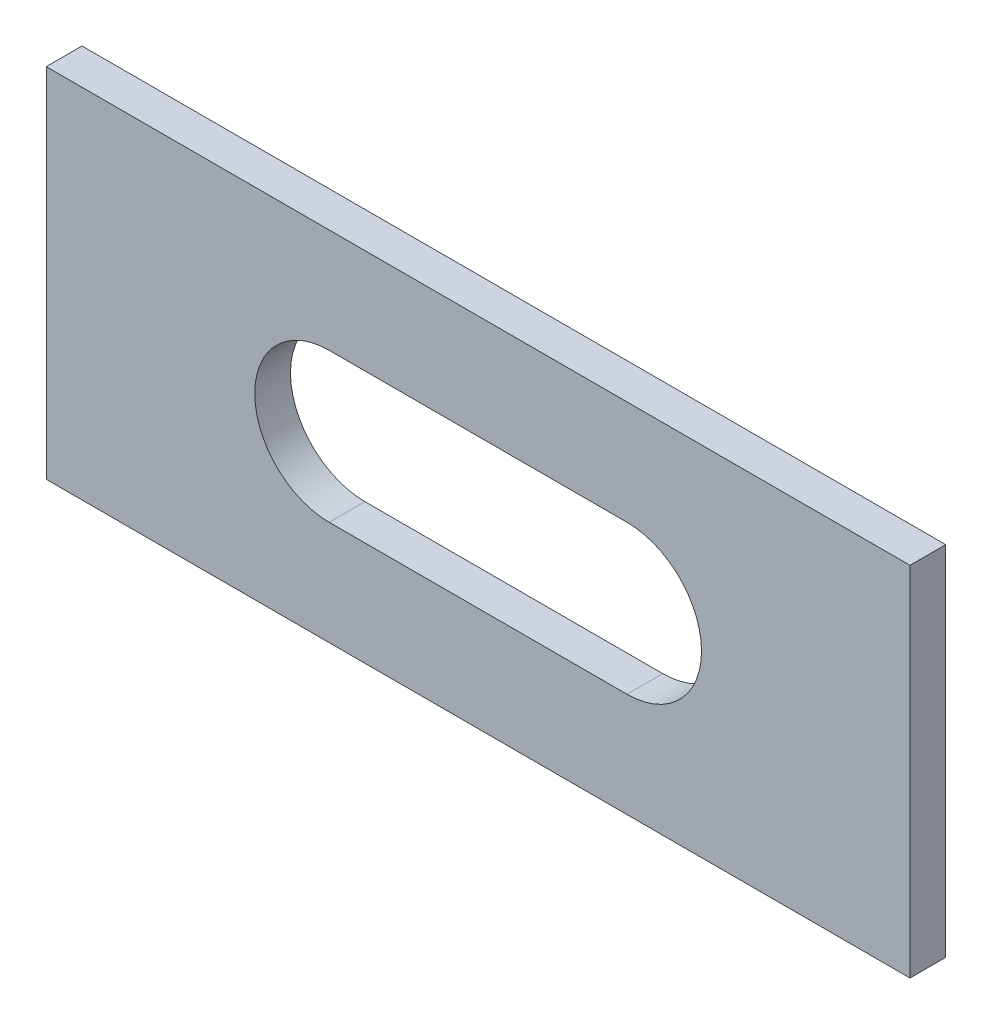
ISO-10303-21;
HEADER;
FILE_DESCRIPTION(('STEP AP214'),'2;1');
FILE_NAME('part.step','',(''),(''),'','','');
FILE_SCHEMA(('AUTOMOTIVE_DESIGN { 1 0 10303 214 1 1 1 1 }'));
ENDSEC;
DATA;
#1=APPLICATION_CONTEXT('core data for automotive mechanical design processes');
#2=APPLICATION_PROTOCOL_DEFINITION('international standard','automotive_design',2000,#1);
#3=PRODUCT_CONTEXT('',#1,'mechanical');
#4=PRODUCT('Part','Part','',(#3));
#5=PRODUCT_RELATED_PRODUCT_CATEGORY('part','',(#4));
#6=PRODUCT_DEFINITION_FORMATION('','',#4);
#7=PRODUCT_DEFINITION_CONTEXT('part definition',#1,'design');
#8=PRODUCT_DEFINITION('design','',#6,#7);
#9=PRODUCT_DEFINITION_SHAPE('','',#8);
#10=(LENGTH_UNIT() NAMED_UNIT(*) SI_UNIT(.MILLI.,.METRE.));
#11=(NAMED_UNIT(*) PLANE_ANGLE_UNIT() SI_UNIT($,.RADIAN.));
#12=(NAMED_UNIT(*) SI_UNIT($,.STERADIAN.) SOLID_ANGLE_UNIT());
#13=UNCERTAINTY_MEASURE_WITH_UNIT(LENGTH_MEASURE(1.E-05),#10,'distance_accuracy_value','');
#14=(GEOMETRIC_REPRESENTATION_CONTEXT(3) GLOBAL_UNCERTAINTY_ASSIGNED_CONTEXT((#13)) GLOBAL_UNIT_ASSIGNED_CONTEXT((#10,
#11,#12)) REPRESENTATION_CONTEXT('',''));
#15=CARTESIAN_POINT('',(0.,0.,0.));
#16=DIRECTION('',(0.,0.,1.));
#17=DIRECTION('',(1.,0.,0.));
#18=AXIS2_PLACEMENT_3D('',#15,#16,#17);
#19=CARTESIAN_POINT('',(0.,0.,6.));
#20=DIRECTION('',(0.,0.,1.));
#21=DIRECTION('',(1.,0.,0.));
#22=AXIS2_PLACEMENT_3D('',#19,#20,#21);
#23=PLANE('',#22);
#24=DIRECTION('',(0.,-1.,0.));
#25=VECTOR('',#24,1.);
#26=CARTESIAN_POINT('',(-72.5,-30.,6.));
#27=LINE('',#26,#25);
#28=CARTESIAN_POINT('',(-72.5,30.,6.));
#29=VERTEX_POINT('',#28);
#30=CARTESIAN_POINT('',(-72.5,-30.,6.));
#31=VERTEX_POINT('',#30);
#32=EDGE_CURVE('E133',#29,#31,#27,.T.);
#33=ORIENTED_EDGE('',*,*,#32,.T.);
#34=DIRECTION('',(1.,0.,0.));
#35=VECTOR('',#34,1.);
#36=CARTESIAN_POINT('',(72.5,-30.,6.));
#37=LINE('',#36,#35);
#38=CARTESIAN_POINT('',(72.5,-30.,6.));
#39=VERTEX_POINT('',#38);
#40=EDGE_CURVE('E136',#31,#39,#37,.T.);
#41=ORIENTED_EDGE('',*,*,#40,.T.);
#42=DIRECTION('',(0.,1.,0.));
#43=VECTOR('',#42,1.);
#44=CARTESIAN_POINT('',(72.5,-30.,6.));
#45=LINE('',#44,#43);
#46=CARTESIAN_POINT('',(72.5,30.,6.));
#47=VERTEX_POINT('',#46);
#48=EDGE_CURVE('E139',#39,#47,#45,.T.);
#49=ORIENTED_EDGE('',*,*,#48,.T.);
#50=DIRECTION('',(-1.,0.,0.));
#51=VECTOR('',#50,1.);
#52=CARTESIAN_POINT('',(72.5,30.,6.));
#53=LINE('',#52,#51);
#54=EDGE_CURVE('E141',#47,#29,#53,.T.);
#55=ORIENTED_EDGE('',*,*,#54,.T.);
#56=EDGE_LOOP('',(#33,#41,#49,#55));
#57=FACE_BOUND('',#56,.T.);
#58=DIRECTION('',(1.,0.,0.));
#59=VECTOR('',#58,1.);
#60=CARTESIAN_POINT('',(-25.,-12.5,6.));
#61=LINE('',#60,#59);
#62=CARTESIAN_POINT('',(-25.,-12.5,6.));
#63=VERTEX_POINT('',#62);
#64=CARTESIAN_POINT('',(25.,-12.5,6.));
#65=VERTEX_POINT('',#64);
#66=EDGE_CURVE('E105',#63,#65,#61,.T.);
#67=ORIENTED_EDGE('',*,*,#66,.F.);
#68=CARTESIAN_POINT('',(-25.,0.,6.));
#69=DIRECTION('',(0.,0.,1.));
#70=DIRECTION('',(1.,0.,0.));
#71=AXIS2_PLACEMENT_3D('',#68,#69,#70);
#72=CIRCLE('',#71,12.5);
#73=CARTESIAN_POINT('',(-25.,12.5,6.));
#74=VERTEX_POINT('',#73);
#75=EDGE_CURVE('E97',#74,#63,#72,.T.);
#76=ORIENTED_EDGE('',*,*,#75,.F.);
#77=DIRECTION('',(-1.,0.,0.));
#78=VECTOR('',#77,1.);
#79=CARTESIAN_POINT('',(-25.,12.5,6.));
#80=LINE('',#79,#78);
#81=CARTESIAN_POINT('',(25.,12.5,6.));
#82=VERTEX_POINT('',#81);
#83=EDGE_CURVE('E119',#82,#74,#80,.T.);
#84=ORIENTED_EDGE('',*,*,#83,.F.);
#85=CARTESIAN_POINT('',(25.,0.,6.));
#86=DIRECTION('',(0.,0.,1.));
#87=DIRECTION('',(1.,0.,0.));
#88=AXIS2_PLACEMENT_3D('',#85,#86,#87);
#89=CIRCLE('',#88,12.5);
#90=EDGE_CURVE('E117',#65,#82,#89,.T.);
#91=ORIENTED_EDGE('',*,*,#90,.F.);
#92=EDGE_LOOP('',(#67,#76,#84,#91));
#93=FACE_BOUND('',#92,.T.);
#94=ADVANCED_FACE('F32',(#57,#93),#23,.T.);
#95=CARTESIAN_POINT('',(0.,0.,0.));
#96=DIRECTION('',(0.,0.,1.));
#97=DIRECTION('',(1.,0.,0.));
#98=AXIS2_PLACEMENT_3D('',#95,#96,#97);
#99=PLANE('',#98);
#100=DIRECTION('',(0.,-1.,0.));
#101=VECTOR('',#100,1.);
#102=CARTESIAN_POINT('',(-72.5,-30.,0.));
#103=LINE('',#102,#101);
#104=CARTESIAN_POINT('',(-72.5,30.,0.));
#105=VERTEX_POINT('',#104);
#106=CARTESIAN_POINT('',(-72.5,-30.,0.));
#107=VERTEX_POINT('',#106);
#108=EDGE_CURVE('E113',#105,#107,#103,.T.);
#109=ORIENTED_EDGE('',*,*,#108,.F.);
#110=DIRECTION('',(-1.,0.,0.));
#111=VECTOR('',#110,1.);
#112=CARTESIAN_POINT('',(72.5,30.,0.));
#113=LINE('',#112,#111);
#114=CARTESIAN_POINT('',(72.5,30.,0.));
#115=VERTEX_POINT('',#114);
#116=EDGE_CURVE('E137',#115,#105,#113,.T.);
#117=ORIENTED_EDGE('',*,*,#116,.F.);
#118=DIRECTION('',(0.,1.,0.));
#119=VECTOR('',#118,1.);
#120=CARTESIAN_POINT('',(72.5,-30.,0.));
#121=LINE('',#120,#119);
#122=CARTESIAN_POINT('',(72.5,-30.,0.));
#123=VERTEX_POINT('',#122);
#124=EDGE_CURVE('E148',#123,#115,#121,.T.);
#125=ORIENTED_EDGE('',*,*,#124,.F.);
#126=DIRECTION('',(1.,0.,0.));
#127=VECTOR('',#126,1.);
#128=CARTESIAN_POINT('',(72.5,-30.,0.));
#129=LINE('',#128,#127);
#130=EDGE_CURVE('E146',#107,#123,#129,.T.);
#131=ORIENTED_EDGE('',*,*,#130,.F.);
#132=EDGE_LOOP('',(#109,#117,#125,#131));
#133=FACE_BOUND('',#132,.T.);
#134=CARTESIAN_POINT('',(-25.,0.,0.));
#135=DIRECTION('',(0.,0.,1.));
#136=DIRECTION('',(1.,0.,0.));
#137=AXIS2_PLACEMENT_3D('',#134,#135,#136);
#138=CIRCLE('',#137,12.5);
#139=CARTESIAN_POINT('',(-25.,12.5,0.));
#140=VERTEX_POINT('',#139);
#141=CARTESIAN_POINT('',(-25.,-12.5,0.));
#142=VERTEX_POINT('',#141);
#143=EDGE_CURVE('E55',#140,#142,#138,.T.);
#144=ORIENTED_EDGE('',*,*,#143,.T.);
#145=DIRECTION('',(1.,0.,0.));
#146=VECTOR('',#145,1.);
#147=CARTESIAN_POINT('',(-25.,-12.5,0.));
#148=LINE('',#147,#146);
#149=CARTESIAN_POINT('',(25.,-12.5,0.));
#150=VERTEX_POINT('',#149);
#151=EDGE_CURVE('E112',#142,#150,#148,.T.);
#152=ORIENTED_EDGE('',*,*,#151,.T.);
#153=CARTESIAN_POINT('',(25.,0.,0.));
#154=DIRECTION('',(0.,0.,1.));
#155=DIRECTION('',(1.,0.,0.));
#156=AXIS2_PLACEMENT_3D('',#153,#154,#155);
#157=CIRCLE('',#156,12.5);
#158=CARTESIAN_POINT('',(25.,12.5,0.));
#159=VERTEX_POINT('',#158);
#160=EDGE_CURVE('E125',#150,#159,#157,.T.);
#161=ORIENTED_EDGE('',*,*,#160,.T.);
#162=DIRECTION('',(-1.,0.,0.));
#163=VECTOR('',#162,1.);
#164=CARTESIAN_POINT('',(-25.,12.5,0.));
#165=LINE('',#164,#163);
#166=EDGE_CURVE('E106',#159,#140,#165,.T.);
#167=ORIENTED_EDGE('',*,*,#166,.T.);
#168=EDGE_LOOP('',(#144,#152,#161,#167));
#169=FACE_BOUND('',#168,.T.);
#170=ADVANCED_FACE('F166',(#133,#169),#99,.F.);
#171=CARTESIAN_POINT('',(-72.5,-30.,6.));
#172=DIRECTION('',(1.,0.,0.));
#173=DIRECTION('',(0.,0.,-1.));
#174=AXIS2_PLACEMENT_3D('',#171,#172,#173);
#175=PLANE('',#174);
#176=ORIENTED_EDGE('',*,*,#108,.T.);
#177=DIRECTION('',(0.,0.,-1.));
#178=VECTOR('',#177,1.);
#179=CARTESIAN_POINT('',(-72.5,-30.,6.));
#180=LINE('',#179,#178);
#181=EDGE_CURVE('E11',#31,#107,#180,.T.);
#182=ORIENTED_EDGE('',*,*,#181,.F.);
#183=ORIENTED_EDGE('',*,*,#32,.F.);
#184=DIRECTION('',(0.,0.,-1.));
#185=VECTOR('',#184,1.);
#186=CARTESIAN_POINT('',(-72.5,30.,6.));
#187=LINE('',#186,#185);
#188=EDGE_CURVE('E143',#29,#105,#187,.T.);
#189=ORIENTED_EDGE('',*,*,#188,.T.);
#190=EDGE_LOOP('',(#176,#182,#183,#189));
#191=FACE_BOUND('',#190,.T.);
#192=ADVANCED_FACE('F34',(#191),#175,.F.);
#193=CARTESIAN_POINT('',(72.5,-30.,6.));
#194=DIRECTION('',(0.,1.,0.));
#195=DIRECTION('',(0.,0.,1.));
#196=AXIS2_PLACEMENT_3D('',#193,#194,#195);
#197=PLANE('',#196);
#198=ORIENTED_EDGE('',*,*,#130,.T.);
#199=DIRECTION('',(0.,0.,-1.));
#200=VECTOR('',#199,1.);
#201=CARTESIAN_POINT('',(72.5,-30.,6.));
#202=LINE('',#201,#200);
#203=EDGE_CURVE('E40',#39,#123,#202,.T.);
#204=ORIENTED_EDGE('',*,*,#203,.F.);
#205=ORIENTED_EDGE('',*,*,#40,.F.);
#206=ORIENTED_EDGE('',*,*,#181,.T.);
#207=EDGE_LOOP('',(#198,#204,#205,#206));
#208=FACE_BOUND('',#207,.T.);
#209=ADVANCED_FACE('F176',(#208),#197,.F.);
#210=CARTESIAN_POINT('',(72.5,-30.,6.));
#211=DIRECTION('',(-1.,0.,0.));
#212=DIRECTION('',(0.,0.,1.));
#213=AXIS2_PLACEMENT_3D('',#210,#211,#212);
#214=PLANE('',#213);
#215=ORIENTED_EDGE('',*,*,#124,.T.);
#216=DIRECTION('',(0.,0.,-1.));
#217=VECTOR('',#216,1.);
#218=CARTESIAN_POINT('',(72.5,30.,6.));
#219=LINE('',#218,#217);
#220=EDGE_CURVE('E153',#47,#115,#219,.T.);
#221=ORIENTED_EDGE('',*,*,#220,.F.);
#222=ORIENTED_EDGE('',*,*,#48,.F.);
#223=ORIENTED_EDGE('',*,*,#203,.T.);
#224=EDGE_LOOP('',(#215,#221,#222,#223));
#225=FACE_BOUND('',#224,.T.);
#226=ADVANCED_FACE('F160',(#225),#214,.F.);
#227=CARTESIAN_POINT('',(72.5,30.,6.));
#228=DIRECTION('',(0.,-1.,0.));
#229=DIRECTION('',(0.,0.,-1.));
#230=AXIS2_PLACEMENT_3D('',#227,#228,#229);
#231=PLANE('',#230);
#232=ORIENTED_EDGE('',*,*,#116,.T.);
#233=ORIENTED_EDGE('',*,*,#188,.F.);
#234=ORIENTED_EDGE('',*,*,#54,.F.);
#235=ORIENTED_EDGE('',*,*,#220,.T.);
#236=EDGE_LOOP('',(#232,#233,#234,#235));
#237=FACE_BOUND('',#236,.T.);
#238=ADVANCED_FACE('F170',(#237),#231,.F.);
#239=CARTESIAN_POINT('',(-25.,0.,6.));
#240=DIRECTION('',(0.,0.,-1.));
#241=DIRECTION('',(-1.,0.,0.));
#242=AXIS2_PLACEMENT_3D('',#239,#240,#241);
#243=CYLINDRICAL_SURFACE('',#242,12.5);
#244=ORIENTED_EDGE('',*,*,#143,.F.);
#245=DIRECTION('',(0.,0.,-1.));
#246=VECTOR('',#245,1.);
#247=CARTESIAN_POINT('',(-25.,12.5,6.));
#248=LINE('',#247,#246);
#249=EDGE_CURVE('E101',#74,#140,#248,.T.);
#250=ORIENTED_EDGE('',*,*,#249,.F.);
#251=ORIENTED_EDGE('',*,*,#75,.T.);
#252=DIRECTION('',(0.,0.,-1.));
#253=VECTOR('',#252,1.);
#254=CARTESIAN_POINT('',(-25.,-12.5,6.));
#255=LINE('',#254,#253);
#256=EDGE_CURVE('E100',#63,#142,#255,.T.);
#257=ORIENTED_EDGE('',*,*,#256,.T.);
#258=EDGE_LOOP('',(#244,#250,#251,#257));
#259=FACE_BOUND('',#258,.T.);
#260=ADVANCED_FACE('F99',(#259),#243,.F.);
#261=CARTESIAN_POINT('',(-25.,-12.5,6.));
#262=DIRECTION('',(0.,1.,0.));
#263=DIRECTION('',(0.,0.,1.));
#264=AXIS2_PLACEMENT_3D('',#261,#262,#263);
#265=PLANE('',#264);
#266=ORIENTED_EDGE('',*,*,#151,.F.);
#267=ORIENTED_EDGE('',*,*,#256,.F.);
#268=ORIENTED_EDGE('',*,*,#66,.T.);
#269=DIRECTION('',(0.,0.,-1.));
#270=VECTOR('',#269,1.);
#271=CARTESIAN_POINT('',(25.,-12.5,6.));
#272=LINE('',#271,#270);
#273=EDGE_CURVE('E114',#65,#150,#272,.T.);
#274=ORIENTED_EDGE('',*,*,#273,.T.);
#275=EDGE_LOOP('',(#266,#267,#268,#274));
#276=FACE_BOUND('',#275,.T.);
#277=ADVANCED_FACE('F109',(#276),#265,.T.);
#278=CARTESIAN_POINT('',(25.,0.,6.));
#279=DIRECTION('',(0.,0.,-1.));
#280=DIRECTION('',(-1.,0.,0.));
#281=AXIS2_PLACEMENT_3D('',#278,#279,#280);
#282=CYLINDRICAL_SURFACE('',#281,12.5);
#283=ORIENTED_EDGE('',*,*,#160,.F.);
#284=ORIENTED_EDGE('',*,*,#273,.F.);
#285=ORIENTED_EDGE('',*,*,#90,.T.);
#286=DIRECTION('',(0.,0.,-1.));
#287=VECTOR('',#286,1.);
#288=CARTESIAN_POINT('',(25.,12.5,6.));
#289=LINE('',#288,#287);
#290=EDGE_CURVE('E47',#82,#159,#289,.T.);
#291=ORIENTED_EDGE('',*,*,#290,.T.);
#292=EDGE_LOOP('',(#283,#284,#285,#291));
#293=FACE_BOUND('',#292,.T.);
#294=ADVANCED_FACE('F199',(#293),#282,.F.);
#295=CARTESIAN_POINT('',(-25.,12.5,6.));
#296=DIRECTION('',(0.,-1.,0.));
#297=DIRECTION('',(0.,0.,-1.));
#298=AXIS2_PLACEMENT_3D('',#295,#296,#297);
#299=PLANE('',#298);
#300=ORIENTED_EDGE('',*,*,#166,.F.);
#301=ORIENTED_EDGE('',*,*,#290,.F.);
#302=ORIENTED_EDGE('',*,*,#83,.T.);
#303=ORIENTED_EDGE('',*,*,#249,.T.);
#304=EDGE_LOOP('',(#300,#301,#302,#303));
#305=FACE_BOUND('',#304,.T.);
#306=ADVANCED_FACE('F203',(#305),#299,.T.);
#307=CLOSED_SHELL('',(#94,#170,#192,#209,#226,#238,#260,#277,#294,#306));
#308=MANIFOLD_SOLID_BREP('B2',#307);
#309=ADVANCED_BREP_SHAPE_REPRESENTATION('',(#18,#308),#14);
#310=SHAPE_DEFINITION_REPRESENTATION(#9,#309);
ENDSEC;
END-ISO-10303-21;
